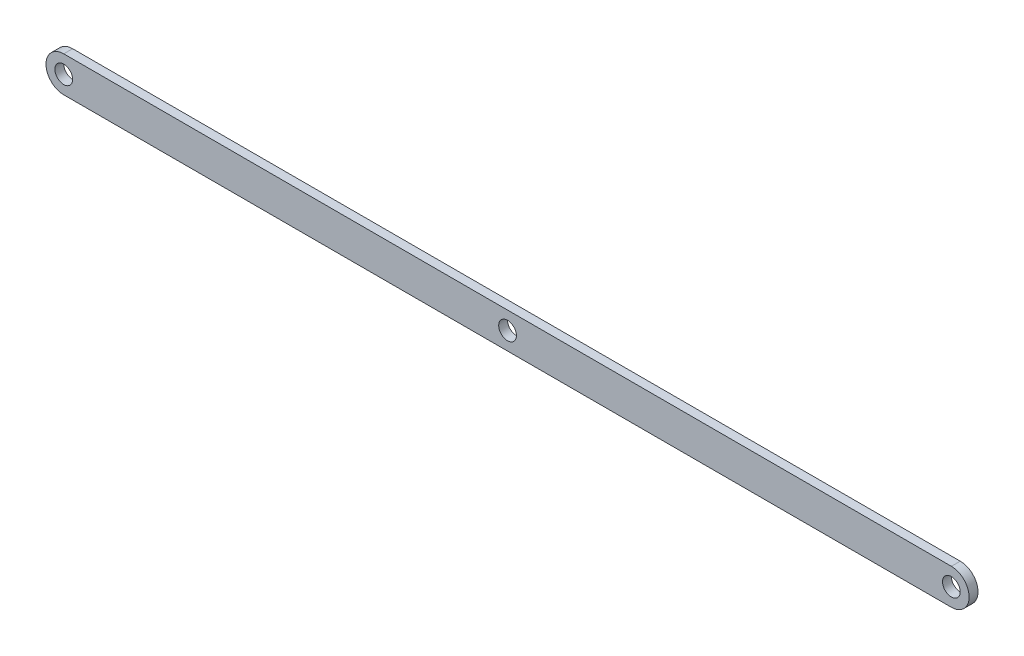
ISO-10303-21;
HEADER;
FILE_DESCRIPTION(('STEP AP214'),'2;1');
FILE_NAME('part.step','',(''),(''),'','','');
FILE_SCHEMA(('AUTOMOTIVE_DESIGN { 1 0 10303 214 1 1 1 1 }'));
ENDSEC;
DATA;
#1=APPLICATION_CONTEXT('core data for automotive mechanical design processes');
#2=APPLICATION_PROTOCOL_DEFINITION('international standard','automotive_design',2000,#1);
#3=PRODUCT_CONTEXT('',#1,'mechanical');
#4=PRODUCT('Part','Part','',(#3));
#5=PRODUCT_RELATED_PRODUCT_CATEGORY('part','',(#4));
#6=PRODUCT_DEFINITION_FORMATION('','',#4);
#7=PRODUCT_DEFINITION_CONTEXT('part definition',#1,'design');
#8=PRODUCT_DEFINITION('design','',#6,#7);
#9=PRODUCT_DEFINITION_SHAPE('','',#8);
#10=(LENGTH_UNIT() NAMED_UNIT(*) SI_UNIT(.MILLI.,.METRE.));
#11=(NAMED_UNIT(*) PLANE_ANGLE_UNIT() SI_UNIT($,.RADIAN.));
#12=(NAMED_UNIT(*) SI_UNIT($,.STERADIAN.) SOLID_ANGLE_UNIT());
#13=UNCERTAINTY_MEASURE_WITH_UNIT(LENGTH_MEASURE(1.E-05),#10,'distance_accuracy_value','');
#14=(GEOMETRIC_REPRESENTATION_CONTEXT(3) GLOBAL_UNCERTAINTY_ASSIGNED_CONTEXT((#13)) GLOBAL_UNIT_ASSIGNED_CONTEXT((#10,
#11,#12)) REPRESENTATION_CONTEXT('',''));
#15=CARTESIAN_POINT('',(0.,0.,0.));
#16=DIRECTION('',(0.,0.,1.));
#17=DIRECTION('',(1.,0.,0.));
#18=AXIS2_PLACEMENT_3D('',#15,#16,#17);
#19=CARTESIAN_POINT('',(-250.,0.,5.));
#20=DIRECTION('',(0.,0.,1.));
#21=DIRECTION('',(1.,0.,0.));
#22=AXIS2_PLACEMENT_3D('',#19,#20,#21);
#23=PLANE('',#22);
#24=CARTESIAN_POINT('',(0.,0.,5.));
#25=DIRECTION('',(0.,0.,1.));
#26=DIRECTION('',(1.,0.,0.));
#27=AXIS2_PLACEMENT_3D('',#24,#25,#26);
#28=CIRCLE('',#27,4.99999999999999);
#29=CARTESIAN_POINT('',(4.99999999999999,0.,5.));
#30=VERTEX_POINT('',#29);
#31=EDGE_CURVE('E123',#30,#30,#28,.T.);
#32=ORIENTED_EDGE('',*,*,#31,.F.);
#33=EDGE_LOOP('',(#32));
#34=FACE_BOUND('',#33,.T.);
#35=CARTESIAN_POINT('',(-250.,0.,5.));
#36=DIRECTION('',(0.,0.,1.));
#37=DIRECTION('',(1.,0.,0.));
#38=AXIS2_PLACEMENT_3D('',#35,#36,#37);
#39=CIRCLE('',#38,10.);
#40=CARTESIAN_POINT('',(-250.,10.,5.));
#41=VERTEX_POINT('',#40);
#42=CARTESIAN_POINT('',(-250.,-10.,5.));
#43=VERTEX_POINT('',#42);
#44=EDGE_CURVE('E93',#41,#43,#39,.T.);
#45=ORIENTED_EDGE('',*,*,#44,.T.);
#46=DIRECTION('',(1.,0.,0.));
#47=VECTOR('',#46,1.);
#48=CARTESIAN_POINT('',(-250.,-10.,5.));
#49=LINE('',#48,#47);
#50=CARTESIAN_POINT('',(250.,-9.99999999999996,5.));
#51=VERTEX_POINT('',#50);
#52=EDGE_CURVE('E88',#43,#51,#49,.T.);
#53=ORIENTED_EDGE('',*,*,#52,.T.);
#54=CARTESIAN_POINT('',(250.,0.,5.));
#55=DIRECTION('',(0.,0.,1.));
#56=DIRECTION('',(1.,0.,0.));
#57=AXIS2_PLACEMENT_3D('',#54,#55,#56);
#58=CIRCLE('',#57,10.);
#59=CARTESIAN_POINT('',(250.,10.,5.));
#60=VERTEX_POINT('',#59);
#61=EDGE_CURVE('E91',#51,#60,#58,.T.);
#62=ORIENTED_EDGE('',*,*,#61,.T.);
#63=DIRECTION('',(-1.,0.,0.));
#64=VECTOR('',#63,1.);
#65=CARTESIAN_POINT('',(-250.,10.,5.));
#66=LINE('',#65,#64);
#67=EDGE_CURVE('E58',#60,#41,#66,.T.);
#68=ORIENTED_EDGE('',*,*,#67,.T.);
#69=EDGE_LOOP('',(#45,#53,#62,#68));
#70=FACE_BOUND('',#69,.T.);
#71=CARTESIAN_POINT('',(-250.,0.,5.));
#72=DIRECTION('',(0.,0.,1.));
#73=DIRECTION('',(1.,0.,0.));
#74=AXIS2_PLACEMENT_3D('',#71,#72,#73);
#75=CIRCLE('',#74,4.99999999999999);
#76=CARTESIAN_POINT('',(-245.,0.,5.));
#77=VERTEX_POINT('',#76);
#78=EDGE_CURVE('E108',#77,#77,#75,.T.);
#79=ORIENTED_EDGE('',*,*,#78,.F.);
#80=EDGE_LOOP('',(#79));
#81=FACE_BOUND('',#80,.T.);
#82=CARTESIAN_POINT('',(250.,0.,5.));
#83=DIRECTION('',(0.,0.,1.));
#84=DIRECTION('',(1.,0.,0.));
#85=AXIS2_PLACEMENT_3D('',#82,#83,#84);
#86=CIRCLE('',#85,4.99999999999999);
#87=CARTESIAN_POINT('',(255.,0.,5.));
#88=VERTEX_POINT('',#87);
#89=EDGE_CURVE('E129',#88,#88,#86,.T.);
#90=ORIENTED_EDGE('',*,*,#89,.F.);
#91=EDGE_LOOP('',(#90));
#92=FACE_BOUND('',#91,.T.);
#93=ADVANCED_FACE('F41',(#34,#70,#81,#92),#23,.T.);
#94=CARTESIAN_POINT('',(-250.,0.,0.));
#95=DIRECTION('',(0.,0.,1.));
#96=DIRECTION('',(1.,0.,0.));
#97=AXIS2_PLACEMENT_3D('',#94,#95,#96);
#98=PLANE('',#97);
#99=CARTESIAN_POINT('',(-250.,0.,0.));
#100=DIRECTION('',(0.,0.,1.));
#101=DIRECTION('',(1.,0.,0.));
#102=AXIS2_PLACEMENT_3D('',#99,#100,#101);
#103=CIRCLE('',#102,10.);
#104=CARTESIAN_POINT('',(-250.,10.,0.));
#105=VERTEX_POINT('',#104);
#106=CARTESIAN_POINT('',(-250.,-10.,0.));
#107=VERTEX_POINT('',#106);
#108=EDGE_CURVE('E105',#105,#107,#103,.T.);
#109=ORIENTED_EDGE('',*,*,#108,.F.);
#110=DIRECTION('',(-1.,0.,0.));
#111=VECTOR('',#110,1.);
#112=CARTESIAN_POINT('',(-250.,10.,0.));
#113=LINE('',#112,#111);
#114=CARTESIAN_POINT('',(250.,10.,0.));
#115=VERTEX_POINT('',#114);
#116=EDGE_CURVE('E81',#115,#105,#113,.T.);
#117=ORIENTED_EDGE('',*,*,#116,.F.);
#118=CARTESIAN_POINT('',(250.,0.,0.));
#119=DIRECTION('',(0.,0.,1.));
#120=DIRECTION('',(1.,0.,0.));
#121=AXIS2_PLACEMENT_3D('',#118,#119,#120);
#122=CIRCLE('',#121,10.);
#123=CARTESIAN_POINT('',(250.,-9.99999999999996,0.));
#124=VERTEX_POINT('',#123);
#125=EDGE_CURVE('E75',#124,#115,#122,.T.);
#126=ORIENTED_EDGE('',*,*,#125,.F.);
#127=DIRECTION('',(1.,0.,0.));
#128=VECTOR('',#127,1.);
#129=CARTESIAN_POINT('',(-250.,-10.,0.));
#130=LINE('',#129,#128);
#131=EDGE_CURVE('E97',#107,#124,#130,.T.);
#132=ORIENTED_EDGE('',*,*,#131,.F.);
#133=EDGE_LOOP('',(#109,#117,#126,#132));
#134=FACE_BOUND('',#133,.T.);
#135=CARTESIAN_POINT('',(-250.,0.,0.));
#136=DIRECTION('',(0.,0.,1.));
#137=DIRECTION('',(1.,0.,0.));
#138=AXIS2_PLACEMENT_3D('',#135,#136,#137);
#139=CIRCLE('',#138,4.99999999999999);
#140=CARTESIAN_POINT('',(-245.,0.,0.));
#141=VERTEX_POINT('',#140);
#142=EDGE_CURVE('E120',#141,#141,#139,.T.);
#143=ORIENTED_EDGE('',*,*,#142,.T.);
#144=EDGE_LOOP('',(#143));
#145=FACE_BOUND('',#144,.T.);
#146=CARTESIAN_POINT('',(0.,0.,0.));
#147=DIRECTION('',(0.,0.,1.));
#148=DIRECTION('',(1.,0.,0.));
#149=AXIS2_PLACEMENT_3D('',#146,#147,#148);
#150=CIRCLE('',#149,4.99999999999999);
#151=CARTESIAN_POINT('',(4.99999999999999,0.,0.));
#152=VERTEX_POINT('',#151);
#153=EDGE_CURVE('E126',#152,#152,#150,.T.);
#154=ORIENTED_EDGE('',*,*,#153,.T.);
#155=EDGE_LOOP('',(#154));
#156=FACE_BOUND('',#155,.T.);
#157=CARTESIAN_POINT('',(250.,0.,0.));
#158=DIRECTION('',(0.,0.,1.));
#159=DIRECTION('',(1.,0.,0.));
#160=AXIS2_PLACEMENT_3D('',#157,#158,#159);
#161=CIRCLE('',#160,4.99999999999999);
#162=CARTESIAN_POINT('',(255.,0.,0.));
#163=VERTEX_POINT('',#162);
#164=EDGE_CURVE('E132',#163,#163,#161,.T.);
#165=ORIENTED_EDGE('',*,*,#164,.T.);
#166=EDGE_LOOP('',(#165));
#167=FACE_BOUND('',#166,.T.);
#168=ADVANCED_FACE('F116',(#134,#145,#156,#167),#98,.F.);
#169=CARTESIAN_POINT('',(-250.,0.,5.));
#170=DIRECTION('',(0.,0.,-1.));
#171=DIRECTION('',(-1.,0.,0.));
#172=AXIS2_PLACEMENT_3D('',#169,#170,#171);
#173=CYLINDRICAL_SURFACE('',#172,10.);
#174=ORIENTED_EDGE('',*,*,#108,.T.);
#175=DIRECTION('',(0.,0.,-1.));
#176=VECTOR('',#175,1.);
#177=CARTESIAN_POINT('',(-250.,-10.,5.));
#178=LINE('',#177,#176);
#179=EDGE_CURVE('E11',#43,#107,#178,.T.);
#180=ORIENTED_EDGE('',*,*,#179,.F.);
#181=ORIENTED_EDGE('',*,*,#44,.F.);
#182=DIRECTION('',(0.,0.,-1.));
#183=VECTOR('',#182,1.);
#184=CARTESIAN_POINT('',(-250.,10.,5.));
#185=LINE('',#184,#183);
#186=EDGE_CURVE('E101',#41,#105,#185,.T.);
#187=ORIENTED_EDGE('',*,*,#186,.T.);
#188=EDGE_LOOP('',(#174,#180,#181,#187));
#189=FACE_BOUND('',#188,.T.);
#190=ADVANCED_FACE('F43',(#189),#173,.T.);
#191=CARTESIAN_POINT('',(-250.,-10.,5.));
#192=DIRECTION('',(0.,1.,0.));
#193=DIRECTION('',(0.,0.,1.));
#194=AXIS2_PLACEMENT_3D('',#191,#192,#193);
#195=PLANE('',#194);
#196=ORIENTED_EDGE('',*,*,#131,.T.);
#197=DIRECTION('',(0.,0.,-1.));
#198=VECTOR('',#197,1.);
#199=CARTESIAN_POINT('',(250.,-9.99999999999996,5.));
#200=LINE('',#199,#198);
#201=EDGE_CURVE('E50',#51,#124,#200,.T.);
#202=ORIENTED_EDGE('',*,*,#201,.F.);
#203=ORIENTED_EDGE('',*,*,#52,.F.);
#204=ORIENTED_EDGE('',*,*,#179,.T.);
#205=EDGE_LOOP('',(#196,#202,#203,#204));
#206=FACE_BOUND('',#205,.T.);
#207=ADVANCED_FACE('F96',(#206),#195,.F.);
#208=CARTESIAN_POINT('',(250.,0.,5.));
#209=DIRECTION('',(0.,0.,-1.));
#210=DIRECTION('',(-1.,0.,0.));
#211=AXIS2_PLACEMENT_3D('',#208,#209,#210);
#212=CYLINDRICAL_SURFACE('',#211,10.);
#213=ORIENTED_EDGE('',*,*,#125,.T.);
#214=DIRECTION('',(0.,0.,-1.));
#215=VECTOR('',#214,1.);
#216=CARTESIAN_POINT('',(250.,10.,5.));
#217=LINE('',#216,#215);
#218=EDGE_CURVE('E98',#60,#115,#217,.T.);
#219=ORIENTED_EDGE('',*,*,#218,.F.);
#220=ORIENTED_EDGE('',*,*,#61,.F.);
#221=ORIENTED_EDGE('',*,*,#201,.T.);
#222=EDGE_LOOP('',(#213,#219,#220,#221));
#223=FACE_BOUND('',#222,.T.);
#224=ADVANCED_FACE('F99',(#223),#212,.T.);
#225=CARTESIAN_POINT('',(-250.,10.,5.));
#226=DIRECTION('',(0.,-1.,0.));
#227=DIRECTION('',(0.,0.,-1.));
#228=AXIS2_PLACEMENT_3D('',#225,#226,#227);
#229=PLANE('',#228);
#230=ORIENTED_EDGE('',*,*,#116,.T.);
#231=ORIENTED_EDGE('',*,*,#186,.F.);
#232=ORIENTED_EDGE('',*,*,#67,.F.);
#233=ORIENTED_EDGE('',*,*,#218,.T.);
#234=EDGE_LOOP('',(#230,#231,#232,#233));
#235=FACE_BOUND('',#234,.T.);
#236=ADVANCED_FACE('F113',(#235),#229,.F.);
#237=CARTESIAN_POINT('',(-250.,0.,5.));
#238=DIRECTION('',(0.,0.,-1.));
#239=DIRECTION('',(-1.,0.,0.));
#240=AXIS2_PLACEMENT_3D('',#237,#238,#239);
#241=CYLINDRICAL_SURFACE('',#240,4.99999999999999);
#242=ORIENTED_EDGE('',*,*,#78,.T.);
#243=EDGE_LOOP('',(#242));
#244=FACE_BOUND('',#243,.T.);
#245=ORIENTED_EDGE('',*,*,#142,.F.);
#246=EDGE_LOOP('',(#245));
#247=FACE_BOUND('',#246,.T.);
#248=ADVANCED_FACE('F150',(#244,#247),#241,.F.);
#249=CARTESIAN_POINT('',(0.,0.,5.));
#250=DIRECTION('',(0.,0.,-1.));
#251=DIRECTION('',(-1.,0.,0.));
#252=AXIS2_PLACEMENT_3D('',#249,#250,#251);
#253=CYLINDRICAL_SURFACE('',#252,4.99999999999999);
#254=ORIENTED_EDGE('',*,*,#31,.T.);
#255=EDGE_LOOP('',(#254));
#256=FACE_BOUND('',#255,.T.);
#257=ORIENTED_EDGE('',*,*,#153,.F.);
#258=EDGE_LOOP('',(#257));
#259=FACE_BOUND('',#258,.T.);
#260=ADVANCED_FACE('F196',(#256,#259),#253,.F.);
#261=CARTESIAN_POINT('',(250.,0.,5.));
#262=DIRECTION('',(0.,0.,-1.));
#263=DIRECTION('',(-1.,0.,0.));
#264=AXIS2_PLACEMENT_3D('',#261,#262,#263);
#265=CYLINDRICAL_SURFACE('',#264,4.99999999999999);
#266=ORIENTED_EDGE('',*,*,#89,.T.);
#267=EDGE_LOOP('',(#266));
#268=FACE_BOUND('',#267,.T.);
#269=ORIENTED_EDGE('',*,*,#164,.F.);
#270=EDGE_LOOP('',(#269));
#271=FACE_BOUND('',#270,.T.);
#272=ADVANCED_FACE('F138',(#268,#271),#265,.F.);
#273=CLOSED_SHELL('',(#93,#168,#190,#207,#224,#236,#248,#260,#272));
#274=MANIFOLD_SOLID_BREP('B2',#273);
#275=ADVANCED_BREP_SHAPE_REPRESENTATION('',(#18,#274),#14);
#276=SHAPE_DEFINITION_REPRESENTATION(#9,#275);
ENDSEC;
END-ISO-10303-21;
